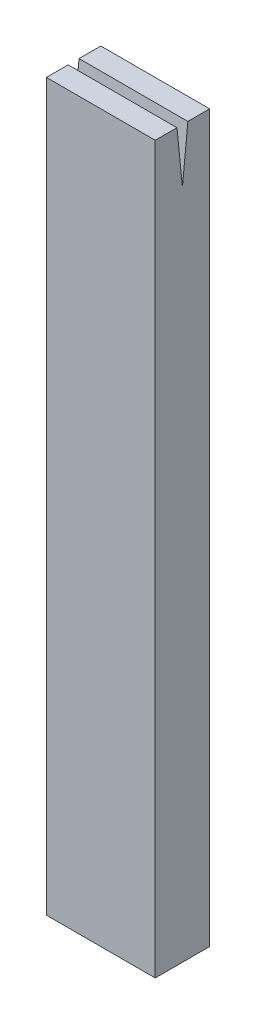
ISO-10303-21;
HEADER;
FILE_DESCRIPTION(('STEP AP214'),'2;1');
FILE_NAME('part.step','',(''),(''),'','','');
FILE_SCHEMA(('AUTOMOTIVE_DESIGN { 1 0 10303 214 1 1 1 1 }'));
ENDSEC;
DATA;
#1=APPLICATION_CONTEXT('core data for automotive mechanical design processes');
#2=APPLICATION_PROTOCOL_DEFINITION('international standard','automotive_design',2000,#1);
#3=PRODUCT_CONTEXT('',#1,'mechanical');
#4=PRODUCT('Part','Part','',(#3));
#5=PRODUCT_RELATED_PRODUCT_CATEGORY('part','',(#4));
#6=PRODUCT_DEFINITION_FORMATION('','',#4);
#7=PRODUCT_DEFINITION_CONTEXT('part definition',#1,'design');
#8=PRODUCT_DEFINITION('design','',#6,#7);
#9=PRODUCT_DEFINITION_SHAPE('','',#8);
#10=(LENGTH_UNIT() NAMED_UNIT(*) SI_UNIT(.MILLI.,.METRE.));
#11=(NAMED_UNIT(*) PLANE_ANGLE_UNIT() SI_UNIT($,.RADIAN.));
#12=(NAMED_UNIT(*) SI_UNIT($,.STERADIAN.) SOLID_ANGLE_UNIT());
#13=UNCERTAINTY_MEASURE_WITH_UNIT(LENGTH_MEASURE(1.E-05),#10,'distance_accuracy_value','');
#14=(GEOMETRIC_REPRESENTATION_CONTEXT(3) GLOBAL_UNCERTAINTY_ASSIGNED_CONTEXT((#13)) GLOBAL_UNIT_ASSIGNED_CONTEXT((#10,
#11,#12)) REPRESENTATION_CONTEXT('',''));
#15=CARTESIAN_POINT('',(0.,0.,0.));
#16=DIRECTION('',(0.,0.,1.));
#17=DIRECTION('',(1.,0.,0.));
#18=AXIS2_PLACEMENT_3D('',#15,#16,#17);
#19=CARTESIAN_POINT('',(0.,400.,0.));
#20=DIRECTION('',(0.,1.,0.));
#21=DIRECTION('',(0.,0.,1.));
#22=AXIS2_PLACEMENT_3D('',#19,#20,#21);
#23=PLANE('',#22);
#24=DIRECTION('',(1.,0.,0.));
#25=VECTOR('',#24,1.);
#26=CARTESIAN_POINT('',(-30.,400.,-3.));
#27=LINE('',#26,#25);
#28=CARTESIAN_POINT('',(-30.,400.,-3.));
#29=VERTEX_POINT('',#28);
#30=CARTESIAN_POINT('',(30.,400.,-3.));
#31=VERTEX_POINT('',#30);
#32=EDGE_CURVE('E106',#29,#31,#27,.T.);
#33=ORIENTED_EDGE('',*,*,#32,.T.);
#34=DIRECTION('',(0.,0.,-1.));
#35=VECTOR('',#34,1.);
#36=CARTESIAN_POINT('',(30.,400.,-15.));
#37=LINE('',#36,#35);
#38=CARTESIAN_POINT('',(30.,400.,-15.));
#39=VERTEX_POINT('',#38);
#40=EDGE_CURVE('E129',#31,#39,#37,.T.);
#41=ORIENTED_EDGE('',*,*,#40,.T.);
#42=DIRECTION('',(-1.,0.,0.));
#43=VECTOR('',#42,1.);
#44=CARTESIAN_POINT('',(-30.,400.,-15.));
#45=LINE('',#44,#43);
#46=CARTESIAN_POINT('',(-30.,400.,-15.));
#47=VERTEX_POINT('',#46);
#48=EDGE_CURVE('E56',#39,#47,#45,.T.);
#49=ORIENTED_EDGE('',*,*,#48,.T.);
#50=DIRECTION('',(0.,0.,1.));
#51=VECTOR('',#50,1.);
#52=CARTESIAN_POINT('',(-30.,400.,-15.));
#53=LINE('',#52,#51);
#54=EDGE_CURVE('E125',#47,#29,#53,.T.);
#55=ORIENTED_EDGE('',*,*,#54,.T.);
#56=EDGE_LOOP('',(#33,#41,#49,#55));
#57=FACE_BOUND('',#56,.T.);
#58=ADVANCED_FACE('F32',(#57),#23,.T.);
#59=CARTESIAN_POINT('',(-30.,400.,-15.));
#60=DIRECTION('',(1.,0.,0.));
#61=DIRECTION('',(0.,0.,-1.));
#62=AXIS2_PLACEMENT_3D('',#59,#60,#61);
#63=PLANE('',#62);
#64=DIRECTION('',(0.,-0.995037190209989,-0.0995037190209988));
#65=VECTOR('',#64,1.);
#66=CARTESIAN_POINT('',(-30.,400.,3.));
#67=LINE('',#66,#65);
#68=CARTESIAN_POINT('',(-30.,400.,3.));
#69=VERTEX_POINT('',#68);
#70=CARTESIAN_POINT('',(-30.,370.,0.));
#71=VERTEX_POINT('',#70);
#72=EDGE_CURVE('E47',#69,#71,#67,.T.);
#73=ORIENTED_EDGE('',*,*,#72,.T.);
#74=DIRECTION('',(0.,0.995037190209989,-0.0995037190209988));
#75=VECTOR('',#74,1.);
#76=CARTESIAN_POINT('',(-30.,370.,0.));
#77=LINE('',#76,#75);
#78=EDGE_CURVE('E110',#71,#29,#77,.T.);
#79=ORIENTED_EDGE('',*,*,#78,.T.);
#80=ORIENTED_EDGE('',*,*,#54,.F.);
#81=DIRECTION('',(0.,-1.,0.));
#82=VECTOR('',#81,1.);
#83=CARTESIAN_POINT('',(-30.,400.,-15.));
#84=LINE('',#83,#82);
#85=CARTESIAN_POINT('',(-30.,0.,-15.));
#86=VERTEX_POINT('',#85);
#87=EDGE_CURVE('E134',#47,#86,#84,.T.);
#88=ORIENTED_EDGE('',*,*,#87,.T.);
#89=DIRECTION('',(0.,0.,1.));
#90=VECTOR('',#89,1.);
#91=CARTESIAN_POINT('',(-30.,0.,-15.));
#92=LINE('',#91,#90);
#93=CARTESIAN_POINT('',(-30.,0.,15.));
#94=VERTEX_POINT('',#93);
#95=EDGE_CURVE('E122',#86,#94,#92,.T.);
#96=ORIENTED_EDGE('',*,*,#95,.T.);
#97=DIRECTION('',(0.,-1.,0.));
#98=VECTOR('',#97,1.);
#99=CARTESIAN_POINT('',(-30.,400.,15.));
#100=LINE('',#99,#98);
#101=CARTESIAN_POINT('',(-30.,400.,15.));
#102=VERTEX_POINT('',#101);
#103=EDGE_CURVE('E11',#102,#94,#100,.T.);
#104=ORIENTED_EDGE('',*,*,#103,.F.);
#105=EDGE_CURVE('E84',#69,#102,#53,.T.);
#106=ORIENTED_EDGE('',*,*,#105,.F.);
#107=EDGE_LOOP('',(#73,#79,#80,#88,#96,#104,#106));
#108=FACE_BOUND('',#107,.T.);
#109=ADVANCED_FACE('F34',(#108),#63,.F.);
#110=CARTESIAN_POINT('',(-30.,400.,15.));
#111=DIRECTION('',(0.,0.,-1.));
#112=DIRECTION('',(-1.,0.,0.));
#113=AXIS2_PLACEMENT_3D('',#110,#111,#112);
#114=PLANE('',#113);
#115=DIRECTION('',(1.,0.,0.));
#116=VECTOR('',#115,1.);
#117=CARTESIAN_POINT('',(-30.,0.,15.));
#118=LINE('',#117,#116);
#119=CARTESIAN_POINT('',(30.,0.,15.));
#120=VERTEX_POINT('',#119);
#121=EDGE_CURVE('E137',#94,#120,#118,.T.);
#122=ORIENTED_EDGE('',*,*,#121,.T.);
#123=DIRECTION('',(0.,-1.,0.));
#124=VECTOR('',#123,1.);
#125=CARTESIAN_POINT('',(30.,400.,15.));
#126=LINE('',#125,#124);
#127=CARTESIAN_POINT('',(30.,400.,15.));
#128=VERTEX_POINT('',#127);
#129=EDGE_CURVE('E40',#128,#120,#126,.T.);
#130=ORIENTED_EDGE('',*,*,#129,.F.);
#131=DIRECTION('',(1.,0.,0.));
#132=VECTOR('',#131,1.);
#133=CARTESIAN_POINT('',(-30.,400.,15.));
#134=LINE('',#133,#132);
#135=EDGE_CURVE('E127',#102,#128,#134,.T.);
#136=ORIENTED_EDGE('',*,*,#135,.F.);
#137=ORIENTED_EDGE('',*,*,#103,.T.);
#138=EDGE_LOOP('',(#122,#130,#136,#137));
#139=FACE_BOUND('',#138,.T.);
#140=ADVANCED_FACE('F163',(#139),#114,.F.);
#141=CARTESIAN_POINT('',(30.,400.,-15.));
#142=DIRECTION('',(-1.,0.,0.));
#143=DIRECTION('',(0.,0.,1.));
#144=AXIS2_PLACEMENT_3D('',#141,#142,#143);
#145=PLANE('',#144);
#146=ORIENTED_EDGE('',*,*,#40,.F.);
#147=DIRECTION('',(0.,0.995037190209989,-0.0995037190209988));
#148=VECTOR('',#147,1.);
#149=CARTESIAN_POINT('',(30.,370.,0.));
#150=LINE('',#149,#148);
#151=CARTESIAN_POINT('',(30.,370.,0.));
#152=VERTEX_POINT('',#151);
#153=EDGE_CURVE('E117',#152,#31,#150,.T.);
#154=ORIENTED_EDGE('',*,*,#153,.F.);
#155=DIRECTION('',(0.,-0.995037190209989,-0.0995037190209988));
#156=VECTOR('',#155,1.);
#157=CARTESIAN_POINT('',(30.,400.,3.));
#158=LINE('',#157,#156);
#159=CARTESIAN_POINT('',(30.,400.,3.));
#160=VERTEX_POINT('',#159);
#161=EDGE_CURVE('E103',#160,#152,#158,.T.);
#162=ORIENTED_EDGE('',*,*,#161,.F.);
#163=EDGE_CURVE('E130',#128,#160,#37,.T.);
#164=ORIENTED_EDGE('',*,*,#163,.F.);
#165=ORIENTED_EDGE('',*,*,#129,.T.);
#166=DIRECTION('',(0.,0.,-1.));
#167=VECTOR('',#166,1.);
#168=CARTESIAN_POINT('',(30.,0.,-15.));
#169=LINE('',#168,#167);
#170=CARTESIAN_POINT('',(30.,0.,-15.));
#171=VERTEX_POINT('',#170);
#172=EDGE_CURVE('E139',#120,#171,#169,.T.);
#173=ORIENTED_EDGE('',*,*,#172,.T.);
#174=DIRECTION('',(0.,-1.,0.));
#175=VECTOR('',#174,1.);
#176=CARTESIAN_POINT('',(30.,400.,-15.));
#177=LINE('',#176,#175);
#178=EDGE_CURVE('E143',#39,#171,#177,.T.);
#179=ORIENTED_EDGE('',*,*,#178,.F.);
#180=EDGE_LOOP('',(#146,#154,#162,#164,#165,#173,#179));
#181=FACE_BOUND('',#180,.T.);
#182=ADVANCED_FACE('F150',(#181),#145,.F.);
#183=CARTESIAN_POINT('',(-30.,400.,-15.));
#184=DIRECTION('',(0.,0.,1.));
#185=DIRECTION('',(1.,0.,0.));
#186=AXIS2_PLACEMENT_3D('',#183,#184,#185);
#187=PLANE('',#186);
#188=DIRECTION('',(-1.,0.,0.));
#189=VECTOR('',#188,1.);
#190=CARTESIAN_POINT('',(-30.,0.,-15.));
#191=LINE('',#190,#189);
#192=EDGE_CURVE('E77',#171,#86,#191,.T.);
#193=ORIENTED_EDGE('',*,*,#192,.T.);
#194=ORIENTED_EDGE('',*,*,#87,.F.);
#195=ORIENTED_EDGE('',*,*,#48,.F.);
#196=ORIENTED_EDGE('',*,*,#178,.T.);
#197=EDGE_LOOP('',(#193,#194,#195,#196));
#198=FACE_BOUND('',#197,.T.);
#199=ADVANCED_FACE('F156',(#198),#187,.F.);
#200=DIRECTION('',(1.,0.,0.));
#201=VECTOR('',#200,1.);
#202=CARTESIAN_POINT('',(-30.,400.,3.));
#203=LINE('',#202,#201);
#204=EDGE_CURVE('E107',#69,#160,#203,.T.);
#205=ORIENTED_EDGE('',*,*,#204,.F.);
#206=ORIENTED_EDGE('',*,*,#105,.T.);
#207=ORIENTED_EDGE('',*,*,#135,.T.);
#208=ORIENTED_EDGE('',*,*,#163,.T.);
#209=EDGE_LOOP('',(#205,#206,#207,#208));
#210=FACE_BOUND('',#209,.T.);
#211=ADVANCED_FACE('F159',(#210),#23,.T.);
#212=CARTESIAN_POINT('',(0.,0.,0.));
#213=DIRECTION('',(0.,1.,0.));
#214=DIRECTION('',(0.,0.,1.));
#215=AXIS2_PLACEMENT_3D('',#212,#213,#214);
#216=PLANE('',#215);
#217=ORIENTED_EDGE('',*,*,#95,.F.);
#218=ORIENTED_EDGE('',*,*,#192,.F.);
#219=ORIENTED_EDGE('',*,*,#172,.F.);
#220=ORIENTED_EDGE('',*,*,#121,.F.);
#221=EDGE_LOOP('',(#217,#218,#219,#220));
#222=FACE_BOUND('',#221,.T.);
#223=ADVANCED_FACE('F155',(#222),#216,.F.);
#224=CARTESIAN_POINT('',(-30.,370.,0.));
#225=DIRECTION('',(0.,-0.0995037190209988,-0.995037190209989));
#226=DIRECTION('',(0.,0.995037190209989,-0.0995037190209988));
#227=AXIS2_PLACEMENT_3D('',#224,#225,#226);
#228=PLANE('',#227);
#229=ORIENTED_EDGE('',*,*,#153,.T.);
#230=ORIENTED_EDGE('',*,*,#32,.F.);
#231=ORIENTED_EDGE('',*,*,#78,.F.);
#232=DIRECTION('',(1.,0.,0.));
#233=VECTOR('',#232,1.);
#234=CARTESIAN_POINT('',(-30.,370.,0.));
#235=LINE('',#234,#233);
#236=EDGE_CURVE('E99',#71,#152,#235,.T.);
#237=ORIENTED_EDGE('',*,*,#236,.T.);
#238=EDGE_LOOP('',(#229,#230,#231,#237));
#239=FACE_BOUND('',#238,.T.);
#240=ADVANCED_FACE('F111',(#239),#228,.F.);
#241=CARTESIAN_POINT('',(-30.,400.,3.));
#242=DIRECTION('',(0.,-0.0995037190209988,0.995037190209989));
#243=DIRECTION('',(0.,-0.995037190209989,-0.0995037190209988));
#244=AXIS2_PLACEMENT_3D('',#241,#242,#243);
#245=PLANE('',#244);
#246=ORIENTED_EDGE('',*,*,#161,.T.);
#247=ORIENTED_EDGE('',*,*,#236,.F.);
#248=ORIENTED_EDGE('',*,*,#72,.F.);
#249=ORIENTED_EDGE('',*,*,#204,.T.);
#250=EDGE_LOOP('',(#246,#247,#248,#249));
#251=FACE_BOUND('',#250,.T.);
#252=ADVANCED_FACE('F101',(#251),#245,.F.);
#253=CLOSED_SHELL('',(#58,#109,#140,#182,#199,#211,#223,#240,#252));
#254=MANIFOLD_SOLID_BREP('B2',#253);
#255=ADVANCED_BREP_SHAPE_REPRESENTATION('',(#18,#254),#14);
#256=SHAPE_DEFINITION_REPRESENTATION(#9,#255);
ENDSEC;
END-ISO-10303-21;
